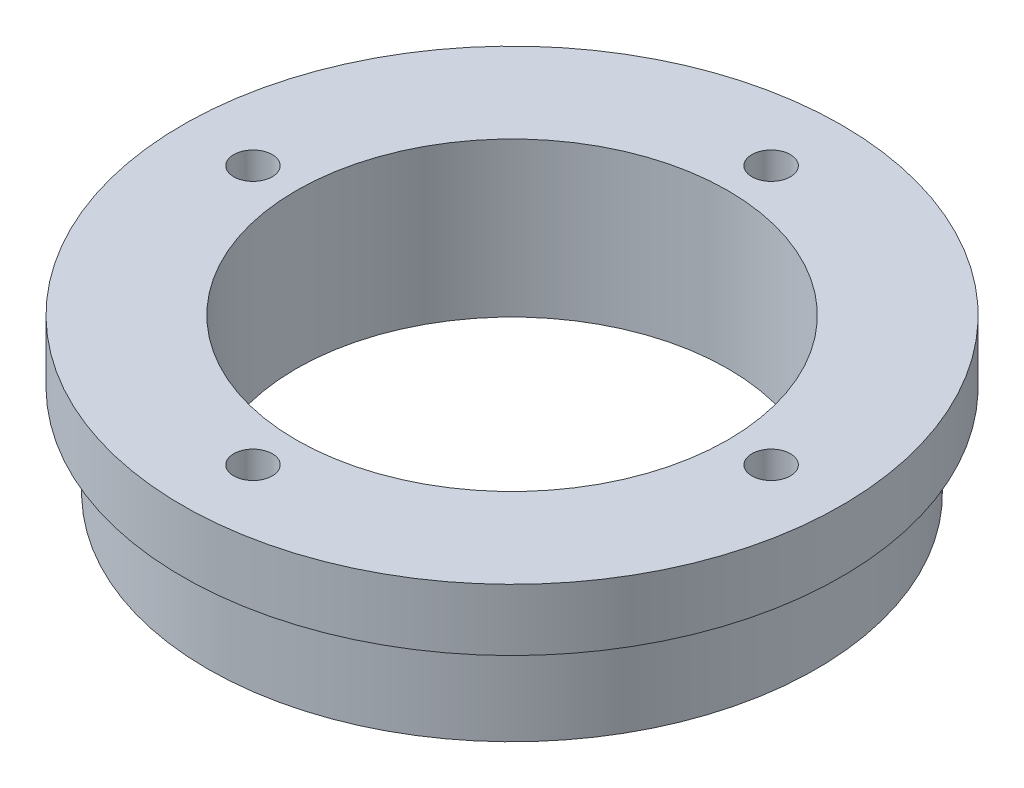
ISO-10303-21;
HEADER;
FILE_DESCRIPTION(('STEP AP214'),'2;1');
FILE_NAME('part.step','',(''),(''),'','','');
FILE_SCHEMA(('AUTOMOTIVE_DESIGN { 1 0 10303 214 1 1 1 1 }'));
ENDSEC;
DATA;
#1=APPLICATION_CONTEXT('core data for automotive mechanical design processes');
#2=APPLICATION_PROTOCOL_DEFINITION('international standard','automotive_design',2000,#1);
#3=PRODUCT_CONTEXT('',#1,'mechanical');
#4=PRODUCT('Part','Part','',(#3));
#5=PRODUCT_RELATED_PRODUCT_CATEGORY('part','',(#4));
#6=PRODUCT_DEFINITION_FORMATION('','',#4);
#7=PRODUCT_DEFINITION_CONTEXT('part definition',#1,'design');
#8=PRODUCT_DEFINITION('design','',#6,#7);
#9=PRODUCT_DEFINITION_SHAPE('','',#8);
#10=(LENGTH_UNIT() NAMED_UNIT(*) SI_UNIT(.MILLI.,.METRE.));
#11=(NAMED_UNIT(*) PLANE_ANGLE_UNIT() SI_UNIT($,.RADIAN.));
#12=(NAMED_UNIT(*) SI_UNIT($,.STERADIAN.) SOLID_ANGLE_UNIT());
#13=UNCERTAINTY_MEASURE_WITH_UNIT(LENGTH_MEASURE(1.E-05),#10,'distance_accuracy_value','');
#14=(GEOMETRIC_REPRESENTATION_CONTEXT(3) GLOBAL_UNCERTAINTY_ASSIGNED_CONTEXT((#13)) GLOBAL_UNIT_ASSIGNED_CONTEXT((#10,
#11,#12)) REPRESENTATION_CONTEXT('',''));
#15=CARTESIAN_POINT('',(0.,0.,0.));
#16=DIRECTION('',(0.,0.,1.));
#17=DIRECTION('',(1.,0.,0.));
#18=AXIS2_PLACEMENT_3D('',#15,#16,#17);
#19=CARTESIAN_POINT('',(0.,-31.75,0.));
#20=DIRECTION('',(0.,-1.,0.));
#21=DIRECTION('',(0.,0.,-1.));
#22=AXIS2_PLACEMENT_3D('',#19,#20,#21);
#23=CYLINDRICAL_SURFACE('',#22,67.8561);
#24=CARTESIAN_POINT('',(0.,0.,0.));
#25=DIRECTION('',(0.,-1.,0.));
#26=DIRECTION('',(0.,0.,-1.));
#27=AXIS2_PLACEMENT_3D('',#24,#25,#26);
#28=CIRCLE('',#27,67.8561);
#29=CARTESIAN_POINT('',(0.,0.,-67.8561));
#30=VERTEX_POINT('',#29);
#31=EDGE_CURVE('E91',#30,#30,#28,.T.);
#32=ORIENTED_EDGE('',*,*,#31,.T.);
#33=EDGE_LOOP('',(#32));
#34=FACE_BOUND('',#33,.T.);
#35=CARTESIAN_POINT('',(0.,-12.7,0.));
#36=DIRECTION('',(0.,-1.,0.));
#37=DIRECTION('',(0.,0.,-1.));
#38=AXIS2_PLACEMENT_3D('',#35,#36,#37);
#39=CIRCLE('',#38,67.8561);
#40=CARTESIAN_POINT('',(0.,-12.7,-67.8561));
#41=VERTEX_POINT('',#40);
#42=EDGE_CURVE('E11',#41,#41,#39,.T.);
#43=ORIENTED_EDGE('',*,*,#42,.F.);
#44=EDGE_LOOP('',(#43));
#45=FACE_BOUND('',#44,.T.);
#46=ADVANCED_FACE('F38',(#34,#45),#23,.T.);
#47=CARTESIAN_POINT('',(67.8561,-12.7,0.));
#48=DIRECTION('',(0.,-1.,0.));
#49=DIRECTION('',(0.,0.,-1.));
#50=AXIS2_PLACEMENT_3D('',#47,#48,#49);
#51=PLANE('',#50);
#52=ORIENTED_EDGE('',*,*,#42,.T.);
#53=EDGE_LOOP('',(#52));
#54=FACE_BOUND('',#53,.T.);
#55=CARTESIAN_POINT('',(0.,-12.7,0.));
#56=DIRECTION('',(0.,-1.,0.));
#57=DIRECTION('',(0.,0.,-1.));
#58=AXIS2_PLACEMENT_3D('',#55,#56,#57);
#59=CIRCLE('',#58,62.6618);
#60=CARTESIAN_POINT('',(0.,-12.7,-62.6618));
#61=VERTEX_POINT('',#60);
#62=EDGE_CURVE('E45',#61,#61,#59,.T.);
#63=ORIENTED_EDGE('',*,*,#62,.F.);
#64=EDGE_LOOP('',(#63));
#65=FACE_BOUND('',#64,.T.);
#66=ADVANCED_FACE('F108',(#54,#65),#51,.T.);
#67=CARTESIAN_POINT('',(0.,-31.75,0.));
#68=DIRECTION('',(0.,-1.,0.));
#69=DIRECTION('',(0.,0.,-1.));
#70=AXIS2_PLACEMENT_3D('',#67,#68,#69);
#71=CYLINDRICAL_SURFACE('',#70,62.6618);
#72=ORIENTED_EDGE('',*,*,#62,.T.);
#73=EDGE_LOOP('',(#72));
#74=FACE_BOUND('',#73,.T.);
#75=CARTESIAN_POINT('',(0.,-31.75,0.));
#76=DIRECTION('',(0.,-1.,0.));
#77=DIRECTION('',(0.,0.,-1.));
#78=AXIS2_PLACEMENT_3D('',#75,#76,#77);
#79=CIRCLE('',#78,62.6618);
#80=CARTESIAN_POINT('',(0.,-31.75,-62.6618));
#81=VERTEX_POINT('',#80);
#82=EDGE_CURVE('E100',#81,#81,#79,.T.);
#83=ORIENTED_EDGE('',*,*,#82,.F.);
#84=EDGE_LOOP('',(#83));
#85=FACE_BOUND('',#84,.T.);
#86=ADVANCED_FACE('F105',(#74,#85),#71,.T.);
#87=CARTESIAN_POINT('',(44.45,-31.75,0.));
#88=DIRECTION('',(0.,-1.,0.));
#89=DIRECTION('',(0.,0.,-1.));
#90=AXIS2_PLACEMENT_3D('',#87,#88,#89);
#91=PLANE('',#90);
#92=ORIENTED_EDGE('',*,*,#82,.T.);
#93=EDGE_LOOP('',(#92));
#94=FACE_BOUND('',#93,.T.);
#95=CARTESIAN_POINT('',(0.,-31.75,0.));
#96=DIRECTION('',(0.,-1.,0.));
#97=DIRECTION('',(0.,0.,-1.));
#98=AXIS2_PLACEMENT_3D('',#95,#96,#97);
#99=CIRCLE('',#98,44.45);
#100=CARTESIAN_POINT('',(0.,-31.75,-44.45));
#101=VERTEX_POINT('',#100);
#102=EDGE_CURVE('E97',#101,#101,#99,.T.);
#103=ORIENTED_EDGE('',*,*,#102,.F.);
#104=EDGE_LOOP('',(#103));
#105=FACE_BOUND('',#104,.T.);
#106=ADVANCED_FACE('F115',(#94,#105),#91,.T.);
#107=CARTESIAN_POINT('',(0.,-31.75,0.));
#108=DIRECTION('',(0.,-1.,0.));
#109=DIRECTION('',(0.,0.,-1.));
#110=AXIS2_PLACEMENT_3D('',#107,#108,#109);
#111=CYLINDRICAL_SURFACE('',#110,44.45);
#112=ORIENTED_EDGE('',*,*,#102,.T.);
#113=EDGE_LOOP('',(#112));
#114=FACE_BOUND('',#113,.T.);
#115=CARTESIAN_POINT('',(0.,0.,0.));
#116=DIRECTION('',(0.,-1.,0.));
#117=DIRECTION('',(0.,0.,-1.));
#118=AXIS2_PLACEMENT_3D('',#115,#116,#117);
#119=CIRCLE('',#118,44.45);
#120=CARTESIAN_POINT('',(0.,0.,-44.45));
#121=VERTEX_POINT('',#120);
#122=EDGE_CURVE('E94',#121,#121,#119,.T.);
#123=ORIENTED_EDGE('',*,*,#122,.F.);
#124=EDGE_LOOP('',(#123));
#125=FACE_BOUND('',#124,.T.);
#126=ADVANCED_FACE('F121',(#114,#125),#111,.F.);
#127=CARTESIAN_POINT('',(67.8561,0.,0.));
#128=DIRECTION('',(0.,1.,0.));
#129=DIRECTION('',(0.,0.,1.));
#130=AXIS2_PLACEMENT_3D('',#127,#128,#129);
#131=PLANE('',#130);
#132=CARTESIAN_POINT('',(-53.34,0.,-5.58707167444723E-13));
#133=DIRECTION('',(0.,1.,0.));
#134=DIRECTION('',(0.,0.,1.));
#135=AXIS2_PLACEMENT_3D('',#132,#133,#134);
#136=CIRCLE('',#135,3.96874999999999);
#137=CARTESIAN_POINT('',(-53.34,0.,3.96874999999943));
#138=VERTEX_POINT('',#137);
#139=EDGE_CURVE('E69',#138,#138,#136,.T.);
#140=ORIENTED_EDGE('',*,*,#139,.F.);
#141=EDGE_LOOP('',(#140));
#142=FACE_BOUND('',#141,.T.);
#143=CARTESIAN_POINT('',(-3.72471444963149E-13,0.,53.34));
#144=DIRECTION('',(0.,1.,0.));
#145=DIRECTION('',(0.,0.,1.));
#146=AXIS2_PLACEMENT_3D('',#143,#144,#145);
#147=CIRCLE('',#146,3.96875);
#148=CARTESIAN_POINT('',(-3.72471444963149E-13,0.,57.30875));
#149=VERTEX_POINT('',#148);
#150=EDGE_CURVE('E68',#149,#149,#147,.T.);
#151=ORIENTED_EDGE('',*,*,#150,.F.);
#152=EDGE_LOOP('',(#151));
#153=FACE_BOUND('',#152,.T.);
#154=CARTESIAN_POINT('',(53.34,0.,1.86235722481574E-13));
#155=DIRECTION('',(0.,1.,0.));
#156=DIRECTION('',(0.,0.,1.));
#157=AXIS2_PLACEMENT_3D('',#154,#155,#156);
#158=CIRCLE('',#157,3.96874999999999);
#159=CARTESIAN_POINT('',(53.34,0.,3.96875000000018));
#160=VERTEX_POINT('',#159);
#161=EDGE_CURVE('E79',#160,#160,#158,.T.);
#162=ORIENTED_EDGE('',*,*,#161,.F.);
#163=EDGE_LOOP('',(#162));
#164=FACE_BOUND('',#163,.T.);
#165=CARTESIAN_POINT('',(0.,0.,-53.34));
#166=DIRECTION('',(0.,1.,0.));
#167=DIRECTION('',(0.,0.,1.));
#168=AXIS2_PLACEMENT_3D('',#165,#166,#167);
#169=CIRCLE('',#168,3.96875);
#170=CARTESIAN_POINT('',(0.,0.,-49.37125));
#171=VERTEX_POINT('',#170);
#172=EDGE_CURVE('E85',#171,#171,#169,.T.);
#173=ORIENTED_EDGE('',*,*,#172,.F.);
#174=EDGE_LOOP('',(#173));
#175=FACE_BOUND('',#174,.T.);
#176=ORIENTED_EDGE('',*,*,#122,.T.);
#177=EDGE_LOOP('',(#176));
#178=FACE_BOUND('',#177,.T.);
#179=ORIENTED_EDGE('',*,*,#31,.F.);
#180=EDGE_LOOP('',(#179));
#181=FACE_BOUND('',#180,.T.);
#182=ADVANCED_FACE('F125',(#142,#153,#164,#175,#178,#181),#131,.T.);
#183=CARTESIAN_POINT('',(0.,-27.0002,-53.34));
#184=DIRECTION('',(0.,1.,0.));
#185=DIRECTION('',(0.,0.,1.));
#186=AXIS2_PLACEMENT_3D('',#183,#184,#185);
#187=CONICAL_SURFACE('',#186,3.96874999999999,1.02974425867665);
#188=CARTESIAN_POINT('',(0.,-29.3848655817656,-53.34));
#189=VERTEX_POINT('',#188);
#190=VERTEX_LOOP('',#189);
#191=FACE_BOUND('',#190,.T.);
#192=CARTESIAN_POINT('',(0.,-27.0002,-53.34));
#193=DIRECTION('',(0.,1.,0.));
#194=DIRECTION('',(0.,0.,1.));
#195=AXIS2_PLACEMENT_3D('',#192,#193,#194);
#196=CIRCLE('',#195,3.96874999999999);
#197=CARTESIAN_POINT('',(0.,-27.0002,-49.37125));
#198=VERTEX_POINT('',#197);
#199=EDGE_CURVE('E88',#198,#198,#196,.T.);
#200=ORIENTED_EDGE('',*,*,#199,.T.);
#201=EDGE_LOOP('',(#200));
#202=FACE_BOUND('',#201,.T.);
#203=ADVANCED_FACE('F129',(#191,#202),#187,.F.);
#204=CARTESIAN_POINT('',(0.,0.,-53.34));
#205=DIRECTION('',(0.,1.,0.));
#206=DIRECTION('',(0.,0.,1.));
#207=AXIS2_PLACEMENT_3D('',#204,#205,#206);
#208=CYLINDRICAL_SURFACE('',#207,3.96874999999999);
#209=ORIENTED_EDGE('',*,*,#199,.F.);
#210=EDGE_LOOP('',(#209));
#211=FACE_BOUND('',#210,.T.);
#212=ORIENTED_EDGE('',*,*,#172,.T.);
#213=EDGE_LOOP('',(#212));
#214=FACE_BOUND('',#213,.T.);
#215=ADVANCED_FACE('F133',(#211,#214),#208,.F.);
#216=CARTESIAN_POINT('',(53.34,-27.0002,1.86235722481574E-13));
#217=DIRECTION('',(0.,1.,0.));
#218=DIRECTION('',(0.,0.,1.));
#219=AXIS2_PLACEMENT_3D('',#216,#217,#218);
#220=CONICAL_SURFACE('',#219,3.96874999999999,1.02974425867665);
#221=CARTESIAN_POINT('',(53.34,-29.3848655817656,1.86235722481574E-13));
#222=VERTEX_POINT('',#221);
#223=VERTEX_LOOP('',#222);
#224=FACE_BOUND('',#223,.T.);
#225=CARTESIAN_POINT('',(53.34,-27.0002,1.86235722481574E-13));
#226=DIRECTION('',(0.,1.,0.));
#227=DIRECTION('',(0.,0.,1.));
#228=AXIS2_PLACEMENT_3D('',#225,#226,#227);
#229=CIRCLE('',#228,3.96874999999999);
#230=CARTESIAN_POINT('',(53.34,-27.0002,3.96875000000018));
#231=VERTEX_POINT('',#230);
#232=EDGE_CURVE('E82',#231,#231,#229,.T.);
#233=ORIENTED_EDGE('',*,*,#232,.T.);
#234=EDGE_LOOP('',(#233));
#235=FACE_BOUND('',#234,.T.);
#236=ADVANCED_FACE('F136',(#224,#235),#220,.F.);
#237=CARTESIAN_POINT('',(53.34,0.,1.86235722481574E-13));
#238=DIRECTION('',(0.,1.,0.));
#239=DIRECTION('',(0.,0.,1.));
#240=AXIS2_PLACEMENT_3D('',#237,#238,#239);
#241=CYLINDRICAL_SURFACE('',#240,3.96874999999999);
#242=ORIENTED_EDGE('',*,*,#232,.F.);
#243=EDGE_LOOP('',(#242));
#244=FACE_BOUND('',#243,.T.);
#245=ORIENTED_EDGE('',*,*,#161,.T.);
#246=EDGE_LOOP('',(#245));
#247=FACE_BOUND('',#246,.T.);
#248=ADVANCED_FACE('F140',(#244,#247),#241,.F.);
#249=CARTESIAN_POINT('',(-3.72471444963149E-13,-27.0002,53.34));
#250=DIRECTION('',(0.,1.,0.));
#251=DIRECTION('',(0.,0.,1.));
#252=AXIS2_PLACEMENT_3D('',#249,#250,#251);
#253=CONICAL_SURFACE('',#252,3.96874999999999,1.02974425867665);
#254=CARTESIAN_POINT('',(-3.79668661278766E-13,-29.3848655817656,53.34));
#255=VERTEX_POINT('',#254);
#256=VERTEX_LOOP('',#255);
#257=FACE_BOUND('',#256,.T.);
#258=CARTESIAN_POINT('',(-3.72471444963149E-13,-27.0002,53.34));
#259=DIRECTION('',(0.,1.,0.));
#260=DIRECTION('',(0.,0.,1.));
#261=AXIS2_PLACEMENT_3D('',#258,#259,#260);
#262=CIRCLE('',#261,3.96874999999999);
#263=CARTESIAN_POINT('',(-3.72471444963149E-13,-27.0002,57.30875));
#264=VERTEX_POINT('',#263);
#265=EDGE_CURVE('E72',#264,#264,#262,.T.);
#266=ORIENTED_EDGE('',*,*,#265,.T.);
#267=EDGE_LOOP('',(#266));
#268=FACE_BOUND('',#267,.T.);
#269=ADVANCED_FACE('F143',(#257,#268),#253,.F.);
#270=CARTESIAN_POINT('',(-3.72471444963149E-13,0.,53.34));
#271=DIRECTION('',(0.,1.,0.));
#272=DIRECTION('',(0.,0.,1.));
#273=AXIS2_PLACEMENT_3D('',#270,#271,#272);
#274=CYLINDRICAL_SURFACE('',#273,3.96874999999999);
#275=ORIENTED_EDGE('',*,*,#265,.F.);
#276=EDGE_LOOP('',(#275));
#277=FACE_BOUND('',#276,.T.);
#278=ORIENTED_EDGE('',*,*,#150,.T.);
#279=EDGE_LOOP('',(#278));
#280=FACE_BOUND('',#279,.T.);
#281=ADVANCED_FACE('F62',(#277,#280),#274,.F.);
#282=CARTESIAN_POINT('',(-53.34,-27.0002,-5.58707167444723E-13));
#283=DIRECTION('',(0.,1.,0.));
#284=DIRECTION('',(0.,0.,1.));
#285=AXIS2_PLACEMENT_3D('',#282,#283,#284);
#286=CONICAL_SURFACE('',#285,3.96874999999999,1.02974425867665);
#287=CARTESIAN_POINT('',(-53.34,-29.3848655817656,-5.58707167444723E-13));
#288=VERTEX_POINT('',#287);
#289=VERTEX_LOOP('',#288);
#290=FACE_BOUND('',#289,.T.);
#291=CARTESIAN_POINT('',(-53.34,-27.0002,-5.58707167444723E-13));
#292=DIRECTION('',(0.,1.,0.));
#293=DIRECTION('',(0.,0.,1.));
#294=AXIS2_PLACEMENT_3D('',#291,#292,#293);
#295=CIRCLE('',#294,3.96874999999999);
#296=CARTESIAN_POINT('',(-53.34,-27.0002,3.96874999999943));
#297=VERTEX_POINT('',#296);
#298=EDGE_CURVE('E66',#297,#297,#295,.T.);
#299=ORIENTED_EDGE('',*,*,#298,.T.);
#300=EDGE_LOOP('',(#299));
#301=FACE_BOUND('',#300,.T.);
#302=ADVANCED_FACE('F58',(#290,#301),#286,.F.);
#303=CARTESIAN_POINT('',(-53.34,0.,-5.58707167444723E-13));
#304=DIRECTION('',(0.,1.,0.));
#305=DIRECTION('',(0.,0.,1.));
#306=AXIS2_PLACEMENT_3D('',#303,#304,#305);
#307=CYLINDRICAL_SURFACE('',#306,3.96874999999999);
#308=ORIENTED_EDGE('',*,*,#298,.F.);
#309=EDGE_LOOP('',(#308));
#310=FACE_BOUND('',#309,.T.);
#311=ORIENTED_EDGE('',*,*,#139,.T.);
#312=EDGE_LOOP('',(#311));
#313=FACE_BOUND('',#312,.T.);
#314=ADVANCED_FACE('F61',(#310,#313),#307,.F.);
#315=CLOSED_SHELL('',(#46,#66,#86,#106,#126,#182,#203,#215,#236,#248,#269,#281,#302,#314));
#316=MANIFOLD_SOLID_BREP('B2',#315);
#317=ADVANCED_BREP_SHAPE_REPRESENTATION('',(#18,#316),#14);
#318=SHAPE_DEFINITION_REPRESENTATION(#9,#317);
ENDSEC;
END-ISO-10303-21;
